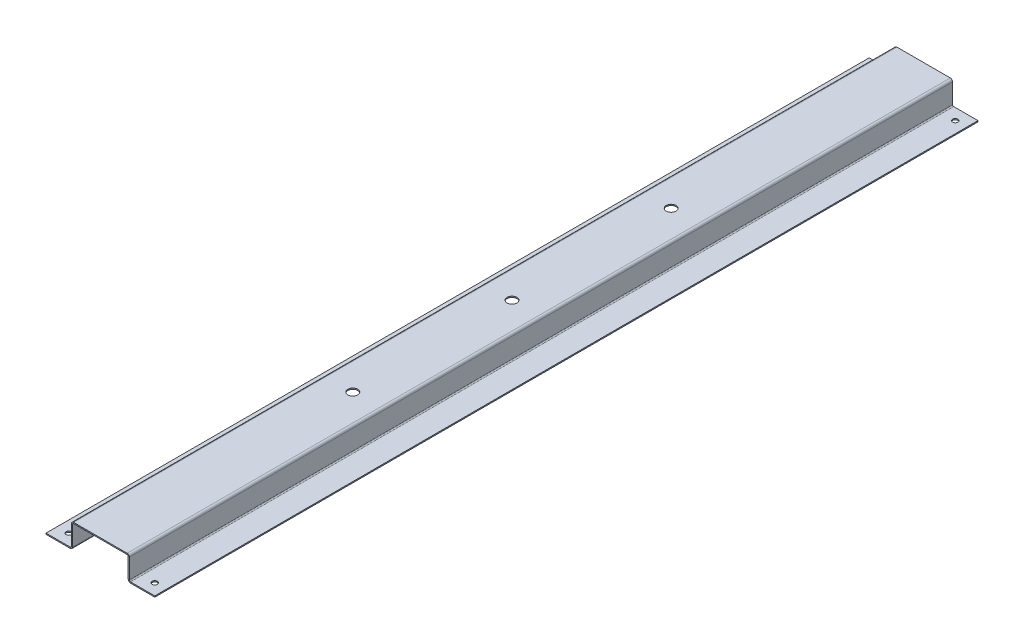
ISO-10303-21;
HEADER;
FILE_DESCRIPTION(('STEP AP214'),'2;1');
FILE_NAME('part.step','',(''),(''),'','','');
FILE_SCHEMA(('AUTOMOTIVE_DESIGN { 1 0 10303 214 1 1 1 1 }'));
ENDSEC;
DATA;
#1=APPLICATION_CONTEXT('core data for automotive mechanical design processes');
#2=APPLICATION_PROTOCOL_DEFINITION('international standard','automotive_design',2000,#1);
#3=PRODUCT_CONTEXT('',#1,'mechanical');
#4=PRODUCT('Part','Part','',(#3));
#5=PRODUCT_RELATED_PRODUCT_CATEGORY('part','',(#4));
#6=PRODUCT_DEFINITION_FORMATION('','',#4);
#7=PRODUCT_DEFINITION_CONTEXT('part definition',#1,'design');
#8=PRODUCT_DEFINITION('design','',#6,#7);
#9=PRODUCT_DEFINITION_SHAPE('','',#8);
#10=(LENGTH_UNIT() NAMED_UNIT(*) SI_UNIT(.MILLI.,.METRE.));
#11=(NAMED_UNIT(*) PLANE_ANGLE_UNIT() SI_UNIT($,.RADIAN.));
#12=(NAMED_UNIT(*) SI_UNIT($,.STERADIAN.) SOLID_ANGLE_UNIT());
#13=UNCERTAINTY_MEASURE_WITH_UNIT(LENGTH_MEASURE(1.E-05),#10,'distance_accuracy_value','');
#14=(GEOMETRIC_REPRESENTATION_CONTEXT(3) GLOBAL_UNCERTAINTY_ASSIGNED_CONTEXT((#13)) GLOBAL_UNIT_ASSIGNED_CONTEXT((#10,
#11,#12)) REPRESENTATION_CONTEXT('',''));
#15=CARTESIAN_POINT('',(0.,0.,0.));
#16=DIRECTION('',(0.,0.,1.));
#17=DIRECTION('',(1.,0.,0.));
#18=AXIS2_PLACEMENT_3D('',#15,#16,#17);
#19=CARTESIAN_POINT('',(36.75,-27.5,543.));
#20=DIRECTION('',(0.,0.,1.));
#21=DIRECTION('',(1.,0.,0.));
#22=AXIS2_PLACEMENT_3D('',#19,#20,#21);
#23=PLANE('',#22);
#24=DIRECTION('',(1.,0.,0.));
#25=VECTOR('',#24,1.);
#26=CARTESIAN_POINT('',(36.75,-27.5,543.));
#27=LINE('',#26,#25);
#28=CARTESIAN_POINT('',(36.75,-27.5,543.));
#29=VERTEX_POINT('',#28);
#30=CARTESIAN_POINT('',(38.25,-27.5,543.));
#31=VERTEX_POINT('',#30);
#32=EDGE_CURVE('E11',#29,#31,#27,.T.);
#33=ORIENTED_EDGE('',*,*,#32,.F.);
#34=CARTESIAN_POINT('',(39.75,-27.5,543.));
#35=DIRECTION('',(0.,0.,1.));
#36=DIRECTION('',(1.,0.,0.));
#37=AXIS2_PLACEMENT_3D('',#34,#35,#36);
#38=CIRCLE('',#37,3.);
#39=CARTESIAN_POINT('',(39.75,-30.5,543.));
#40=VERTEX_POINT('',#39);
#41=EDGE_CURVE('E374',#40,#29,#38,.F.);
#42=ORIENTED_EDGE('',*,*,#41,.F.);
#43=DIRECTION('',(0.,-1.,0.));
#44=VECTOR('',#43,1.);
#45=CARTESIAN_POINT('',(39.75,-29.,543.));
#46=LINE('',#45,#44);
#47=CARTESIAN_POINT('',(39.75,-29.,543.));
#48=VERTEX_POINT('',#47);
#49=EDGE_CURVE('E52',#48,#40,#46,.T.);
#50=ORIENTED_EDGE('',*,*,#49,.F.);
#51=CARTESIAN_POINT('',(39.75,-27.5,543.));
#52=DIRECTION('',(0.,0.,1.));
#53=DIRECTION('',(1.,0.,0.));
#54=AXIS2_PLACEMENT_3D('',#51,#52,#53);
#55=CIRCLE('',#54,1.5);
#56=EDGE_CURVE('E387',#48,#31,#55,.F.);
#57=ORIENTED_EDGE('',*,*,#56,.T.);
#58=EDGE_LOOP('',(#33,#42,#50,#57));
#59=FACE_BOUND('',#58,.T.);
#60=ADVANCED_FACE('F44',(#59),#23,.T.);
#61=CARTESIAN_POINT('',(39.75,-29.,543.));
#62=DIRECTION('',(0.,0.,1.));
#63=DIRECTION('',(1.,0.,0.));
#64=AXIS2_PLACEMENT_3D('',#61,#62,#63);
#65=PLANE('',#64);
#66=DIRECTION('',(0.,1.,0.));
#67=VECTOR('',#66,1.);
#68=CARTESIAN_POINT('',(36.75,0.,543.));
#69=LINE('',#68,#67);
#70=CARTESIAN_POINT('',(36.75,-1.5,543.));
#71=VERTEX_POINT('',#70);
#72=EDGE_CURVE('E378',#29,#71,#69,.T.);
#73=ORIENTED_EDGE('',*,*,#72,.F.);
#74=ORIENTED_EDGE('',*,*,#32,.T.);
#75=DIRECTION('',(0.,1.,0.));
#76=VECTOR('',#75,1.);
#77=CARTESIAN_POINT('',(38.25,0.,543.));
#78=LINE('',#77,#76);
#79=CARTESIAN_POINT('',(38.25,-1.5,543.));
#80=VERTEX_POINT('',#79);
#81=EDGE_CURVE('E389',#31,#80,#78,.T.);
#82=ORIENTED_EDGE('',*,*,#81,.T.);
#83=DIRECTION('',(-1.,0.,0.));
#84=VECTOR('',#83,1.);
#85=CARTESIAN_POINT('',(38.25,-1.5,543.));
#86=LINE('',#85,#84);
#87=EDGE_CURVE('E348',#80,#71,#86,.T.);
#88=ORIENTED_EDGE('',*,*,#87,.T.);
#89=EDGE_LOOP('',(#73,#74,#82,#88));
#90=FACE_BOUND('',#89,.T.);
#91=ADVANCED_FACE('F459',(#90),#65,.T.);
#92=CARTESIAN_POINT('',(39.75,-30.5,-543.));
#93=DIRECTION('',(0.,0.,-1.));
#94=DIRECTION('',(-1.,0.,0.));
#95=AXIS2_PLACEMENT_3D('',#92,#93,#94);
#96=PLANE('',#95);
#97=DIRECTION('',(0.,1.,0.));
#98=VECTOR('',#97,1.);
#99=CARTESIAN_POINT('',(39.75,-30.5,-543.));
#100=LINE('',#99,#98);
#101=CARTESIAN_POINT('',(39.75,-30.5,-543.));
#102=VERTEX_POINT('',#101);
#103=CARTESIAN_POINT('',(39.75,-29.,-543.));
#104=VERTEX_POINT('',#103);
#105=EDGE_CURVE('E354',#102,#104,#100,.T.);
#106=ORIENTED_EDGE('',*,*,#105,.F.);
#107=CARTESIAN_POINT('',(39.75,-27.5,-543.));
#108=DIRECTION('',(0.,0.,1.));
#109=DIRECTION('',(1.,0.,0.));
#110=AXIS2_PLACEMENT_3D('',#107,#108,#109);
#111=CIRCLE('',#110,3.);
#112=CARTESIAN_POINT('',(36.75,-27.5,-543.));
#113=VERTEX_POINT('',#112);
#114=EDGE_CURVE('E258',#102,#113,#111,.F.);
#115=ORIENTED_EDGE('',*,*,#114,.T.);
#116=DIRECTION('',(-1.,0.,0.));
#117=VECTOR('',#116,1.);
#118=CARTESIAN_POINT('',(38.25,-27.5,-543.));
#119=LINE('',#118,#117);
#120=CARTESIAN_POINT('',(38.25,-27.5,-543.));
#121=VERTEX_POINT('',#120);
#122=EDGE_CURVE('E352',#121,#113,#119,.T.);
#123=ORIENTED_EDGE('',*,*,#122,.F.);
#124=CARTESIAN_POINT('',(39.75,-27.5,-543.));
#125=DIRECTION('',(0.,0.,1.));
#126=DIRECTION('',(1.,0.,0.));
#127=AXIS2_PLACEMENT_3D('',#124,#125,#126);
#128=CIRCLE('',#127,1.5);
#129=EDGE_CURVE('E270',#104,#121,#128,.F.);
#130=ORIENTED_EDGE('',*,*,#129,.F.);
#131=EDGE_LOOP('',(#106,#115,#123,#130));
#132=FACE_BOUND('',#131,.T.);
#133=ADVANCED_FACE('F501',(#132),#96,.T.);
#134=CARTESIAN_POINT('',(38.25,-27.5,-543.));
#135=DIRECTION('',(0.,0.,-1.));
#136=DIRECTION('',(-1.,0.,0.));
#137=AXIS2_PLACEMENT_3D('',#134,#135,#136);
#138=PLANE('',#137);
#139=DIRECTION('',(-1.,0.,0.));
#140=VECTOR('',#139,1.);
#141=CARTESIAN_POINT('',(36.75,-30.5,-543.));
#142=LINE('',#141,#140);
#143=CARTESIAN_POINT('',(71.75,-30.5,-543.));
#144=VERTEX_POINT('',#143);
#145=EDGE_CURVE('E261',#144,#102,#142,.T.);
#146=ORIENTED_EDGE('',*,*,#145,.T.);
#147=ORIENTED_EDGE('',*,*,#105,.T.);
#148=DIRECTION('',(-1.,0.,0.));
#149=VECTOR('',#148,1.);
#150=CARTESIAN_POINT('',(36.75,-29.,-543.));
#151=LINE('',#150,#149);
#152=CARTESIAN_POINT('',(71.75,-29.,-543.));
#153=VERTEX_POINT('',#152);
#154=EDGE_CURVE('E267',#153,#104,#151,.T.);
#155=ORIENTED_EDGE('',*,*,#154,.F.);
#156=DIRECTION('',(0.,-1.,0.));
#157=VECTOR('',#156,1.);
#158=CARTESIAN_POINT('',(71.75,-29.,-543.));
#159=LINE('',#158,#157);
#160=EDGE_CURVE('E264',#153,#144,#159,.T.);
#161=ORIENTED_EDGE('',*,*,#160,.T.);
#162=EDGE_LOOP('',(#146,#147,#155,#161));
#163=FACE_BOUND('',#162,.T.);
#164=ADVANCED_FACE('F505',(#163),#138,.T.);
#165=CARTESIAN_POINT('',(35.25,0.,543.));
#166=DIRECTION('',(0.,0.,1.));
#167=DIRECTION('',(1.,0.,0.));
#168=AXIS2_PLACEMENT_3D('',#165,#166,#167);
#169=PLANE('',#168);
#170=DIRECTION('',(0.,1.,0.));
#171=VECTOR('',#170,1.);
#172=CARTESIAN_POINT('',(35.25,0.,543.));
#173=LINE('',#172,#171);
#174=CARTESIAN_POINT('',(35.25,0.,543.));
#175=VERTEX_POINT('',#174);
#176=CARTESIAN_POINT('',(35.25,1.5,543.));
#177=VERTEX_POINT('',#176);
#178=EDGE_CURVE('E350',#175,#177,#173,.T.);
#179=ORIENTED_EDGE('',*,*,#178,.F.);
#180=CARTESIAN_POINT('',(35.25,-1.5,543.));
#181=DIRECTION('',(0.,0.,-1.));
#182=DIRECTION('',(-1.,0.,0.));
#183=AXIS2_PLACEMENT_3D('',#180,#181,#182);
#184=CIRCLE('',#183,1.5);
#185=EDGE_CURVE('E449',#71,#175,#184,.F.);
#186=ORIENTED_EDGE('',*,*,#185,.F.);
#187=ORIENTED_EDGE('',*,*,#87,.F.);
#188=CARTESIAN_POINT('',(35.25,-1.5,543.));
#189=DIRECTION('',(0.,0.,1.));
#190=DIRECTION('',(1.,0.,0.));
#191=AXIS2_PLACEMENT_3D('',#188,#189,#190);
#192=CIRCLE('',#191,3.);
#193=EDGE_CURVE('E392',#80,#177,#192,.T.);
#194=ORIENTED_EDGE('',*,*,#193,.T.);
#195=EDGE_LOOP('',(#179,#186,#187,#194));
#196=FACE_BOUND('',#195,.T.);
#197=ADVANCED_FACE('F466',(#196),#169,.T.);
#198=CARTESIAN_POINT('',(38.25,-1.5,543.));
#199=DIRECTION('',(0.,0.,1.));
#200=DIRECTION('',(1.,0.,0.));
#201=AXIS2_PLACEMENT_3D('',#198,#199,#200);
#202=PLANE('',#201);
#203=DIRECTION('',(-1.,0.,0.));
#204=VECTOR('',#203,1.);
#205=CARTESIAN_POINT('',(-36.75,0.,543.));
#206=LINE('',#205,#204);
#207=CARTESIAN_POINT('',(-35.25,0.,543.));
#208=VERTEX_POINT('',#207);
#209=EDGE_CURVE('E446',#175,#208,#206,.T.);
#210=ORIENTED_EDGE('',*,*,#209,.F.);
#211=ORIENTED_EDGE('',*,*,#178,.T.);
#212=DIRECTION('',(1.,0.,0.));
#213=VECTOR('',#212,1.);
#214=CARTESIAN_POINT('',(-36.75,1.5,543.));
#215=LINE('',#214,#213);
#216=CARTESIAN_POINT('',(-35.25,1.5,543.));
#217=VERTEX_POINT('',#216);
#218=EDGE_CURVE('E211',#177,#217,#215,.F.);
#219=ORIENTED_EDGE('',*,*,#218,.T.);
#220=DIRECTION('',(0.,-1.,0.));
#221=VECTOR('',#220,1.);
#222=CARTESIAN_POINT('',(-35.25,1.5,543.));
#223=LINE('',#222,#221);
#224=EDGE_CURVE('E202',#217,#208,#223,.T.);
#225=ORIENTED_EDGE('',*,*,#224,.T.);
#226=EDGE_LOOP('',(#210,#211,#219,#225));
#227=FACE_BOUND('',#226,.T.);
#228=ADVANCED_FACE('F398',(#227),#202,.T.);
#229=CARTESIAN_POINT('',(36.75,-1.5,-543.));
#230=DIRECTION('',(0.,0.,-1.));
#231=DIRECTION('',(-1.,0.,0.));
#232=AXIS2_PLACEMENT_3D('',#229,#230,#231);
#233=PLANE('',#232);
#234=DIRECTION('',(1.,0.,0.));
#235=VECTOR('',#234,1.);
#236=CARTESIAN_POINT('',(36.75,-1.5,-543.));
#237=LINE('',#236,#235);
#238=CARTESIAN_POINT('',(36.75,-1.5,-543.));
#239=VERTEX_POINT('',#238);
#240=CARTESIAN_POINT('',(38.25,-1.5,-543.));
#241=VERTEX_POINT('',#240);
#242=EDGE_CURVE('E346',#239,#241,#237,.T.);
#243=ORIENTED_EDGE('',*,*,#242,.F.);
#244=CARTESIAN_POINT('',(35.25,-1.5,-543.));
#245=DIRECTION('',(0.,0.,-1.));
#246=DIRECTION('',(-1.,0.,0.));
#247=AXIS2_PLACEMENT_3D('',#244,#245,#246);
#248=CIRCLE('',#247,1.5);
#249=CARTESIAN_POINT('',(35.25,0.,-543.));
#250=VERTEX_POINT('',#249);
#251=EDGE_CURVE('E252',#239,#250,#248,.F.);
#252=ORIENTED_EDGE('',*,*,#251,.T.);
#253=DIRECTION('',(0.,-1.,0.));
#254=VECTOR('',#253,1.);
#255=CARTESIAN_POINT('',(35.25,1.5,-543.));
#256=LINE('',#255,#254);
#257=CARTESIAN_POINT('',(35.25,1.5,-543.));
#258=VERTEX_POINT('',#257);
#259=EDGE_CURVE('E201',#258,#250,#256,.T.);
#260=ORIENTED_EDGE('',*,*,#259,.F.);
#261=CARTESIAN_POINT('',(35.25,-1.5,-543.));
#262=DIRECTION('',(0.,0.,1.));
#263=DIRECTION('',(1.,0.,0.));
#264=AXIS2_PLACEMENT_3D('',#261,#262,#263);
#265=CIRCLE('',#264,3.);
#266=EDGE_CURVE('E276',#241,#258,#265,.T.);
#267=ORIENTED_EDGE('',*,*,#266,.F.);
#268=EDGE_LOOP('',(#243,#252,#260,#267));
#269=FACE_BOUND('',#268,.T.);
#270=ADVANCED_FACE('F475',(#269),#233,.T.);
#271=CARTESIAN_POINT('',(35.25,1.5,-543.));
#272=DIRECTION('',(0.,0.,-1.));
#273=DIRECTION('',(-1.,0.,0.));
#274=AXIS2_PLACEMENT_3D('',#271,#272,#273);
#275=PLANE('',#274);
#276=DIRECTION('',(0.,1.,0.));
#277=VECTOR('',#276,1.);
#278=CARTESIAN_POINT('',(36.75,0.,-543.));
#279=LINE('',#278,#277);
#280=EDGE_CURVE('E255',#113,#239,#279,.T.);
#281=ORIENTED_EDGE('',*,*,#280,.T.);
#282=ORIENTED_EDGE('',*,*,#242,.T.);
#283=DIRECTION('',(0.,1.,0.));
#284=VECTOR('',#283,1.);
#285=CARTESIAN_POINT('',(38.25,0.,-543.));
#286=LINE('',#285,#284);
#287=EDGE_CURVE('E273',#121,#241,#286,.T.);
#288=ORIENTED_EDGE('',*,*,#287,.F.);
#289=ORIENTED_EDGE('',*,*,#122,.T.);
#290=EDGE_LOOP('',(#281,#282,#288,#289));
#291=FACE_BOUND('',#290,.T.);
#292=ADVANCED_FACE('F479',(#291),#275,.T.);
#293=CARTESIAN_POINT('',(-36.75,-1.5,543.));
#294=DIRECTION('',(0.,0.,1.));
#295=DIRECTION('',(1.,0.,0.));
#296=AXIS2_PLACEMENT_3D('',#293,#294,#295);
#297=PLANE('',#296);
#298=DIRECTION('',(-1.,0.,0.));
#299=VECTOR('',#298,1.);
#300=CARTESIAN_POINT('',(-36.75,-1.5,543.));
#301=LINE('',#300,#299);
#302=CARTESIAN_POINT('',(-36.75,-1.5,543.));
#303=VERTEX_POINT('',#302);
#304=CARTESIAN_POINT('',(-38.25,-1.5,543.));
#305=VERTEX_POINT('',#304);
#306=EDGE_CURVE('E189',#303,#305,#301,.T.);
#307=ORIENTED_EDGE('',*,*,#306,.F.);
#308=CARTESIAN_POINT('',(-35.25,-1.5,543.));
#309=DIRECTION('',(0.,0.,-1.));
#310=DIRECTION('',(-1.,0.,0.));
#311=AXIS2_PLACEMENT_3D('',#308,#309,#310);
#312=CIRCLE('',#311,1.5);
#313=EDGE_CURVE('E410',#208,#303,#312,.F.);
#314=ORIENTED_EDGE('',*,*,#313,.F.);
#315=ORIENTED_EDGE('',*,*,#224,.F.);
#316=CARTESIAN_POINT('',(-35.25,-1.5,543.));
#317=DIRECTION('',(0.,0.,1.));
#318=DIRECTION('',(1.,0.,0.));
#319=AXIS2_PLACEMENT_3D('',#316,#317,#318);
#320=CIRCLE('',#319,3.);
#321=EDGE_CURVE('E205',#217,#305,#320,.T.);
#322=ORIENTED_EDGE('',*,*,#321,.T.);
#323=EDGE_LOOP('',(#307,#314,#315,#322));
#324=FACE_BOUND('',#323,.T.);
#325=ADVANCED_FACE('F207',(#324),#297,.T.);
#326=CARTESIAN_POINT('',(-35.25,1.5,543.));
#327=DIRECTION('',(0.,0.,1.));
#328=DIRECTION('',(1.,0.,0.));
#329=AXIS2_PLACEMENT_3D('',#326,#327,#328);
#330=PLANE('',#329);
#331=DIRECTION('',(0.,-1.,0.));
#332=VECTOR('',#331,1.);
#333=CARTESIAN_POINT('',(-36.75,0.,543.));
#334=LINE('',#333,#332);
#335=CARTESIAN_POINT('',(-36.75,-27.5,543.));
#336=VERTEX_POINT('',#335);
#337=EDGE_CURVE('E196',#303,#336,#334,.T.);
#338=ORIENTED_EDGE('',*,*,#337,.F.);
#339=ORIENTED_EDGE('',*,*,#306,.T.);
#340=DIRECTION('',(0.,-1.,0.));
#341=VECTOR('',#340,1.);
#342=CARTESIAN_POINT('',(-38.25,0.,543.));
#343=LINE('',#342,#341);
#344=CARTESIAN_POINT('',(-38.25,-27.5,543.));
#345=VERTEX_POINT('',#344);
#346=EDGE_CURVE('E193',#305,#345,#343,.T.);
#347=ORIENTED_EDGE('',*,*,#346,.T.);
#348=DIRECTION('',(1.,0.,0.));
#349=VECTOR('',#348,1.);
#350=CARTESIAN_POINT('',(-38.25,-27.5,543.));
#351=LINE('',#350,#349);
#352=EDGE_CURVE('E337',#345,#336,#351,.T.);
#353=ORIENTED_EDGE('',*,*,#352,.T.);
#354=EDGE_LOOP('',(#338,#339,#347,#353));
#355=FACE_BOUND('',#354,.T.);
#356=ADVANCED_FACE('F191',(#355),#330,.T.);
#357=CARTESIAN_POINT('',(-35.25,0.,-543.));
#358=DIRECTION('',(0.,0.,-1.));
#359=DIRECTION('',(-1.,0.,0.));
#360=AXIS2_PLACEMENT_3D('',#357,#358,#359);
#361=PLANE('',#360);
#362=DIRECTION('',(0.,1.,0.));
#363=VECTOR('',#362,1.);
#364=CARTESIAN_POINT('',(-35.25,0.,-543.));
#365=LINE('',#364,#363);
#366=CARTESIAN_POINT('',(-35.25,0.,-543.));
#367=VERTEX_POINT('',#366);
#368=CARTESIAN_POINT('',(-35.25,1.5,-543.));
#369=VERTEX_POINT('',#368);
#370=EDGE_CURVE('E342',#367,#369,#365,.T.);
#371=ORIENTED_EDGE('',*,*,#370,.F.);
#372=CARTESIAN_POINT('',(-35.25,-1.5,-543.));
#373=DIRECTION('',(0.,0.,-1.));
#374=DIRECTION('',(-1.,0.,0.));
#375=AXIS2_PLACEMENT_3D('',#372,#373,#374);
#376=CIRCLE('',#375,1.5);
#377=CARTESIAN_POINT('',(-36.75,-1.5,-543.));
#378=VERTEX_POINT('',#377);
#379=EDGE_CURVE('E246',#367,#378,#376,.F.);
#380=ORIENTED_EDGE('',*,*,#379,.T.);
#381=DIRECTION('',(1.,0.,0.));
#382=VECTOR('',#381,1.);
#383=CARTESIAN_POINT('',(-38.25,-1.5,-543.));
#384=LINE('',#383,#382);
#385=CARTESIAN_POINT('',(-38.25,-1.5,-543.));
#386=VERTEX_POINT('',#385);
#387=EDGE_CURVE('E340',#386,#378,#384,.T.);
#388=ORIENTED_EDGE('',*,*,#387,.F.);
#389=CARTESIAN_POINT('',(-35.25,-1.5,-543.));
#390=DIRECTION('',(0.,0.,1.));
#391=DIRECTION('',(1.,0.,0.));
#392=AXIS2_PLACEMENT_3D('',#389,#390,#391);
#393=CIRCLE('',#392,3.);
#394=EDGE_CURVE('E218',#369,#386,#393,.T.);
#395=ORIENTED_EDGE('',*,*,#394,.F.);
#396=EDGE_LOOP('',(#371,#380,#388,#395));
#397=FACE_BOUND('',#396,.T.);
#398=ADVANCED_FACE('F404',(#397),#361,.T.);
#399=CARTESIAN_POINT('',(-38.25,-1.5,-543.));
#400=DIRECTION('',(0.,0.,-1.));
#401=DIRECTION('',(-1.,0.,0.));
#402=AXIS2_PLACEMENT_3D('',#399,#400,#401);
#403=PLANE('',#402);
#404=DIRECTION('',(-1.,0.,0.));
#405=VECTOR('',#404,1.);
#406=CARTESIAN_POINT('',(-36.75,0.,-543.));
#407=LINE('',#406,#405);
#408=EDGE_CURVE('E249',#250,#367,#407,.T.);
#409=ORIENTED_EDGE('',*,*,#408,.T.);
#410=ORIENTED_EDGE('',*,*,#370,.T.);
#411=DIRECTION('',(1.,0.,0.));
#412=VECTOR('',#411,1.);
#413=CARTESIAN_POINT('',(-36.75,1.5,-543.));
#414=LINE('',#413,#412);
#415=EDGE_CURVE('E279',#258,#369,#414,.F.);
#416=ORIENTED_EDGE('',*,*,#415,.F.);
#417=ORIENTED_EDGE('',*,*,#259,.T.);
#418=EDGE_LOOP('',(#409,#410,#416,#417));
#419=FACE_BOUND('',#418,.T.);
#420=ADVANCED_FACE('F485',(#419),#403,.T.);
#421=CARTESIAN_POINT('',(-39.75,-30.5,543.));
#422=DIRECTION('',(0.,0.,1.));
#423=DIRECTION('',(1.,0.,0.));
#424=AXIS2_PLACEMENT_3D('',#421,#422,#423);
#425=PLANE('',#424);
#426=DIRECTION('',(0.,1.,0.));
#427=VECTOR('',#426,1.);
#428=CARTESIAN_POINT('',(-39.75,-30.5,543.));
#429=LINE('',#428,#427);
#430=CARTESIAN_POINT('',(-39.75,-30.5,543.));
#431=VERTEX_POINT('',#430);
#432=CARTESIAN_POINT('',(-39.75,-29.,543.));
#433=VERTEX_POINT('',#432);
#434=EDGE_CURVE('E60',#431,#433,#429,.T.);
#435=ORIENTED_EDGE('',*,*,#434,.F.);
#436=CARTESIAN_POINT('',(-39.75,-27.5,543.));
#437=DIRECTION('',(0.,0.,1.));
#438=DIRECTION('',(1.,0.,0.));
#439=AXIS2_PLACEMENT_3D('',#436,#437,#438);
#440=CIRCLE('',#439,3.);
#441=EDGE_CURVE('E438',#336,#431,#440,.F.);
#442=ORIENTED_EDGE('',*,*,#441,.F.);
#443=ORIENTED_EDGE('',*,*,#352,.F.);
#444=CARTESIAN_POINT('',(-39.75,-27.5,543.));
#445=DIRECTION('',(0.,0.,1.));
#446=DIRECTION('',(1.,0.,0.));
#447=AXIS2_PLACEMENT_3D('',#444,#445,#446);
#448=CIRCLE('',#447,1.5);
#449=EDGE_CURVE('E226',#345,#433,#448,.F.);
#450=ORIENTED_EDGE('',*,*,#449,.T.);
#451=EDGE_LOOP('',(#435,#442,#443,#450));
#452=FACE_BOUND('',#451,.T.);
#453=ADVANCED_FACE('F487',(#452),#425,.T.);
#454=CARTESIAN_POINT('',(-38.25,-27.5,543.));
#455=DIRECTION('',(0.,0.,1.));
#456=DIRECTION('',(1.,0.,0.));
#457=AXIS2_PLACEMENT_3D('',#454,#455,#456);
#458=PLANE('',#457);
#459=DIRECTION('',(-1.,0.,0.));
#460=VECTOR('',#459,1.);
#461=CARTESIAN_POINT('',(-36.75,-30.5,543.));
#462=LINE('',#461,#460);
#463=CARTESIAN_POINT('',(-71.75,-30.5,543.));
#464=VERTEX_POINT('',#463);
#465=EDGE_CURVE('E436',#431,#464,#462,.T.);
#466=ORIENTED_EDGE('',*,*,#465,.F.);
#467=ORIENTED_EDGE('',*,*,#434,.T.);
#468=DIRECTION('',(1.,0.,0.));
#469=VECTOR('',#468,1.);
#470=CARTESIAN_POINT('',(-36.75,-29.,543.));
#471=LINE('',#470,#469);
#472=CARTESIAN_POINT('',(-71.75,-29.,543.));
#473=VERTEX_POINT('',#472);
#474=EDGE_CURVE('E138',#433,#473,#471,.F.);
#475=ORIENTED_EDGE('',*,*,#474,.T.);
#476=DIRECTION('',(0.,1.,0.));
#477=VECTOR('',#476,1.);
#478=CARTESIAN_POINT('',(-71.75,-30.5,543.));
#479=LINE('',#478,#477);
#480=EDGE_CURVE('E434',#464,#473,#479,.T.);
#481=ORIENTED_EDGE('',*,*,#480,.F.);
#482=EDGE_LOOP('',(#466,#467,#475,#481));
#483=FACE_BOUND('',#482,.T.);
#484=ADVANCED_FACE('F493',(#483),#458,.T.);
#485=CARTESIAN_POINT('',(-36.75,-27.5,-543.));
#486=DIRECTION('',(0.,0.,-1.));
#487=DIRECTION('',(-1.,0.,0.));
#488=AXIS2_PLACEMENT_3D('',#485,#486,#487);
#489=PLANE('',#488);
#490=DIRECTION('',(-1.,0.,0.));
#491=VECTOR('',#490,1.);
#492=CARTESIAN_POINT('',(-36.75,-27.5,-543.));
#493=LINE('',#492,#491);
#494=CARTESIAN_POINT('',(-36.75,-27.5,-543.));
#495=VERTEX_POINT('',#494);
#496=CARTESIAN_POINT('',(-38.25,-27.5,-543.));
#497=VERTEX_POINT('',#496);
#498=EDGE_CURVE('E125',#495,#497,#493,.T.);
#499=ORIENTED_EDGE('',*,*,#498,.F.);
#500=CARTESIAN_POINT('',(-39.75,-27.5,-543.));
#501=DIRECTION('',(0.,0.,1.));
#502=DIRECTION('',(1.,0.,0.));
#503=AXIS2_PLACEMENT_3D('',#500,#501,#502);
#504=CIRCLE('',#503,3.);
#505=CARTESIAN_POINT('',(-39.75,-30.5,-543.));
#506=VERTEX_POINT('',#505);
#507=EDGE_CURVE('E242',#495,#506,#504,.F.);
#508=ORIENTED_EDGE('',*,*,#507,.T.);
#509=DIRECTION('',(0.,-1.,0.));
#510=VECTOR('',#509,1.);
#511=CARTESIAN_POINT('',(-39.75,-29.,-543.));
#512=LINE('',#511,#510);
#513=CARTESIAN_POINT('',(-39.75,-29.,-543.));
#514=VERTEX_POINT('',#513);
#515=EDGE_CURVE('E132',#514,#506,#512,.T.);
#516=ORIENTED_EDGE('',*,*,#515,.F.);
#517=CARTESIAN_POINT('',(-39.75,-27.5,-543.));
#518=DIRECTION('',(0.,0.,1.));
#519=DIRECTION('',(1.,0.,0.));
#520=AXIS2_PLACEMENT_3D('',#517,#518,#519);
#521=CIRCLE('',#520,1.5);
#522=EDGE_CURVE('E285',#497,#514,#521,.F.);
#523=ORIENTED_EDGE('',*,*,#522,.F.);
#524=EDGE_LOOP('',(#499,#508,#516,#523));
#525=FACE_BOUND('',#524,.T.);
#526=ADVANCED_FACE('F421',(#525),#489,.T.);
#527=CARTESIAN_POINT('',(-39.75,-29.,-543.));
#528=DIRECTION('',(0.,0.,-1.));
#529=DIRECTION('',(-1.,0.,0.));
#530=AXIS2_PLACEMENT_3D('',#527,#528,#529);
#531=PLANE('',#530);
#532=DIRECTION('',(0.,-1.,0.));
#533=VECTOR('',#532,1.);
#534=CARTESIAN_POINT('',(-36.75,0.,-543.));
#535=LINE('',#534,#533);
#536=EDGE_CURVE('E244',#378,#495,#535,.T.);
#537=ORIENTED_EDGE('',*,*,#536,.T.);
#538=ORIENTED_EDGE('',*,*,#498,.T.);
#539=DIRECTION('',(0.,-1.,0.));
#540=VECTOR('',#539,1.);
#541=CARTESIAN_POINT('',(-38.25,0.,-543.));
#542=LINE('',#541,#540);
#543=EDGE_CURVE('E283',#386,#497,#542,.T.);
#544=ORIENTED_EDGE('',*,*,#543,.F.);
#545=ORIENTED_EDGE('',*,*,#387,.T.);
#546=EDGE_LOOP('',(#537,#538,#544,#545));
#547=FACE_BOUND('',#546,.T.);
#548=ADVANCED_FACE('F406',(#547),#531,.T.);
#549=CARTESIAN_POINT('',(-36.75,-29.,543.));
#550=DIRECTION('',(0.,-1.,0.));
#551=DIRECTION('',(0.,0.,-1.));
#552=AXIS2_PLACEMENT_3D('',#549,#550,#551);
#553=PLANE('',#552);
#554=CARTESIAN_POINT('',(-56.75,-29.,-528.));
#555=DIRECTION('',(0.,-1.,0.));
#556=DIRECTION('',(1.,0.,0.));
#557=AXIS2_PLACEMENT_3D('',#554,#555,#556);
#558=CIRCLE('',#557,3.50000000000001);
#559=CARTESIAN_POINT('',(-53.25,-29.,-528.));
#560=VERTEX_POINT('',#559);
#561=EDGE_CURVE('E997',#560,#560,#558,.T.);
#562=ORIENTED_EDGE('',*,*,#561,.T.);
#563=EDGE_LOOP('',(#562));
#564=FACE_BOUND('',#563,.T.);
#565=CARTESIAN_POINT('',(-56.75,-29.,528.));
#566=DIRECTION('',(0.,-1.,0.));
#567=DIRECTION('',(1.,0.,0.));
#568=AXIS2_PLACEMENT_3D('',#565,#566,#567);
#569=CIRCLE('',#568,3.50000000000001);
#570=CARTESIAN_POINT('',(-53.25,-29.,528.));
#571=VERTEX_POINT('',#570);
#572=EDGE_CURVE('E990',#571,#571,#569,.T.);
#573=ORIENTED_EDGE('',*,*,#572,.T.);
#574=EDGE_LOOP('',(#573));
#575=FACE_BOUND('',#574,.T.);
#576=DIRECTION('',(1.,0.,0.));
#577=VECTOR('',#576,1.);
#578=CARTESIAN_POINT('',(-36.75,-29.,-543.));
#579=LINE('',#578,#577);
#580=CARTESIAN_POINT('',(-71.75,-29.,-543.));
#581=VERTEX_POINT('',#580);
#582=EDGE_CURVE('E232',#514,#581,#579,.F.);
#583=ORIENTED_EDGE('',*,*,#582,.T.);
#584=DIRECTION('',(0.,0.,-1.));
#585=VECTOR('',#584,1.);
#586=CARTESIAN_POINT('',(-71.75,-29.,543.));
#587=LINE('',#586,#585);
#588=EDGE_CURVE('E333',#473,#581,#587,.T.);
#589=ORIENTED_EDGE('',*,*,#588,.F.);
#590=ORIENTED_EDGE('',*,*,#474,.F.);
#591=DIRECTION('',(0.,0.,-1.));
#592=VECTOR('',#591,1.);
#593=CARTESIAN_POINT('',(-39.75,-29.,543.));
#594=LINE('',#593,#592);
#595=EDGE_CURVE('E228',#433,#514,#594,.T.);
#596=ORIENTED_EDGE('',*,*,#595,.T.);
#597=EDGE_LOOP('',(#583,#589,#590,#596));
#598=FACE_BOUND('',#597,.T.);
#599=ADVANCED_FACE('F427',(#564,#575,#598),#553,.F.);
#600=CARTESIAN_POINT('',(-71.75,-30.5,543.));
#601=DIRECTION('',(-1.,0.,0.));
#602=DIRECTION('',(0.,0.,1.));
#603=AXIS2_PLACEMENT_3D('',#600,#601,#602);
#604=PLANE('',#603);
#605=DIRECTION('',(0.,1.,0.));
#606=VECTOR('',#605,1.);
#607=CARTESIAN_POINT('',(-71.75,-30.5,-543.));
#608=LINE('',#607,#606);
#609=CARTESIAN_POINT('',(-71.75,-30.5,-543.));
#610=VERTEX_POINT('',#609);
#611=EDGE_CURVE('E235',#610,#581,#608,.T.);
#612=ORIENTED_EDGE('',*,*,#611,.F.);
#613=DIRECTION('',(0.,0.,-1.));
#614=VECTOR('',#613,1.);
#615=CARTESIAN_POINT('',(-71.75,-30.5,543.));
#616=LINE('',#615,#614);
#617=EDGE_CURVE('E331',#464,#610,#616,.T.);
#618=ORIENTED_EDGE('',*,*,#617,.F.);
#619=ORIENTED_EDGE('',*,*,#480,.T.);
#620=ORIENTED_EDGE('',*,*,#588,.T.);
#621=EDGE_LOOP('',(#612,#618,#619,#620));
#622=FACE_BOUND('',#621,.T.);
#623=ADVANCED_FACE('F432',(#622),#604,.T.);
#624=CARTESIAN_POINT('',(-36.75,-30.5,543.));
#625=DIRECTION('',(0.,-1.,0.));
#626=DIRECTION('',(0.,0.,-1.));
#627=AXIS2_PLACEMENT_3D('',#624,#625,#626);
#628=PLANE('',#627);
#629=CARTESIAN_POINT('',(-56.75,-30.5,-528.));
#630=DIRECTION('',(0.,-1.,0.));
#631=DIRECTION('',(1.,0.,0.));
#632=AXIS2_PLACEMENT_3D('',#629,#630,#631);
#633=CIRCLE('',#632,3.50000000000001);
#634=CARTESIAN_POINT('',(-53.25,-30.5,-528.));
#635=VERTEX_POINT('',#634);
#636=EDGE_CURVE('E1000',#635,#635,#633,.T.);
#637=ORIENTED_EDGE('',*,*,#636,.F.);
#638=EDGE_LOOP('',(#637));
#639=FACE_BOUND('',#638,.T.);
#640=CARTESIAN_POINT('',(-56.75,-30.5,528.));
#641=DIRECTION('',(0.,-1.,0.));
#642=DIRECTION('',(1.,0.,0.));
#643=AXIS2_PLACEMENT_3D('',#640,#641,#642);
#644=CIRCLE('',#643,3.50000000000001);
#645=CARTESIAN_POINT('',(-53.25,-30.5,528.));
#646=VERTEX_POINT('',#645);
#647=EDGE_CURVE('E994',#646,#646,#644,.T.);
#648=ORIENTED_EDGE('',*,*,#647,.F.);
#649=EDGE_LOOP('',(#648));
#650=FACE_BOUND('',#649,.T.);
#651=DIRECTION('',(-1.,0.,0.));
#652=VECTOR('',#651,1.);
#653=CARTESIAN_POINT('',(-36.75,-30.5,-543.));
#654=LINE('',#653,#652);
#655=EDGE_CURVE('E239',#506,#610,#654,.T.);
#656=ORIENTED_EDGE('',*,*,#655,.F.);
#657=DIRECTION('',(0.,0.,-1.));
#658=VECTOR('',#657,1.);
#659=CARTESIAN_POINT('',(-39.75,-30.5,543.));
#660=LINE('',#659,#658);
#661=EDGE_CURVE('E328',#431,#506,#660,.T.);
#662=ORIENTED_EDGE('',*,*,#661,.F.);
#663=ORIENTED_EDGE('',*,*,#465,.T.);
#664=ORIENTED_EDGE('',*,*,#617,.T.);
#665=EDGE_LOOP('',(#656,#662,#663,#664));
#666=FACE_BOUND('',#665,.T.);
#667=ADVANCED_FACE('F594',(#639,#650,#666),#628,.T.);
#668=CARTESIAN_POINT('',(-39.75,-27.5,543.));
#669=DIRECTION('',(0.,0.,-1.));
#670=DIRECTION('',(-1.,0.,0.));
#671=AXIS2_PLACEMENT_3D('',#668,#669,#670);
#672=CYLINDRICAL_SURFACE('',#671,3.);
#673=ORIENTED_EDGE('',*,*,#507,.F.);
#674=DIRECTION('',(0.,0.,-1.));
#675=VECTOR('',#674,1.);
#676=CARTESIAN_POINT('',(-36.75,-27.5,543.));
#677=LINE('',#676,#675);
#678=EDGE_CURVE('E325',#336,#495,#677,.T.);
#679=ORIENTED_EDGE('',*,*,#678,.F.);
#680=ORIENTED_EDGE('',*,*,#441,.T.);
#681=ORIENTED_EDGE('',*,*,#661,.T.);
#682=EDGE_LOOP('',(#673,#679,#680,#681));
#683=FACE_BOUND('',#682,.T.);
#684=ADVANCED_FACE('F418',(#683),#672,.T.);
#685=CARTESIAN_POINT('',(-36.75,0.,543.));
#686=DIRECTION('',(1.,0.,0.));
#687=DIRECTION('',(0.,1.,0.));
#688=AXIS2_PLACEMENT_3D('',#685,#686,#687);
#689=PLANE('',#688);
#690=ORIENTED_EDGE('',*,*,#536,.F.);
#691=DIRECTION('',(0.,0.,-1.));
#692=VECTOR('',#691,1.);
#693=CARTESIAN_POINT('',(-36.75,-1.5,543.));
#694=LINE('',#693,#692);
#695=EDGE_CURVE('E322',#303,#378,#694,.T.);
#696=ORIENTED_EDGE('',*,*,#695,.F.);
#697=ORIENTED_EDGE('',*,*,#337,.T.);
#698=ORIENTED_EDGE('',*,*,#678,.T.);
#699=EDGE_LOOP('',(#690,#696,#697,#698));
#700=FACE_BOUND('',#699,.T.);
#701=ADVANCED_FACE('F412',(#700),#689,.T.);
#702=CARTESIAN_POINT('',(-35.25,-1.5,543.));
#703=DIRECTION('',(0.,0.,-1.));
#704=DIRECTION('',(-1.,0.,0.));
#705=AXIS2_PLACEMENT_3D('',#702,#703,#704);
#706=CYLINDRICAL_SURFACE('',#705,1.5);
#707=ORIENTED_EDGE('',*,*,#379,.F.);
#708=DIRECTION('',(0.,0.,-1.));
#709=VECTOR('',#708,1.);
#710=CARTESIAN_POINT('',(-35.25,0.,543.));
#711=LINE('',#710,#709);
#712=EDGE_CURVE('E319',#208,#367,#711,.T.);
#713=ORIENTED_EDGE('',*,*,#712,.F.);
#714=ORIENTED_EDGE('',*,*,#313,.T.);
#715=ORIENTED_EDGE('',*,*,#695,.T.);
#716=EDGE_LOOP('',(#707,#713,#714,#715));
#717=FACE_BOUND('',#716,.T.);
#718=ADVANCED_FACE('F409',(#717),#706,.F.);
#719=CARTESIAN_POINT('',(-36.75,0.,543.));
#720=DIRECTION('',(0.,-1.,0.));
#721=DIRECTION('',(0.,0.,-1.));
#722=AXIS2_PLACEMENT_3D('',#719,#720,#721);
#723=PLANE('',#722);
#724=CARTESIAN_POINT('',(0.,0.,-210.));
#725=DIRECTION('',(0.,1.,0.));
#726=DIRECTION('',(0.,0.,1.));
#727=AXIS2_PLACEMENT_3D('',#724,#725,#726);
#728=CIRCLE('',#727,6.5);
#729=CARTESIAN_POINT('',(0.,0.,-203.5));
#730=VERTEX_POINT('',#729);
#731=EDGE_CURVE('E970',#730,#730,#728,.T.);
#732=ORIENTED_EDGE('',*,*,#731,.T.);
#733=EDGE_LOOP('',(#732));
#734=FACE_BOUND('',#733,.T.);
#735=CARTESIAN_POINT('',(0.,0.,0.));
#736=DIRECTION('',(0.,1.,0.));
#737=DIRECTION('',(0.,0.,1.));
#738=AXIS2_PLACEMENT_3D('',#735,#736,#737);
#739=CIRCLE('',#738,6.5);
#740=CARTESIAN_POINT('',(0.,0.,6.5));
#741=VERTEX_POINT('',#740);
#742=EDGE_CURVE('E974',#741,#741,#739,.T.);
#743=ORIENTED_EDGE('',*,*,#742,.T.);
#744=EDGE_LOOP('',(#743));
#745=FACE_BOUND('',#744,.T.);
#746=CARTESIAN_POINT('',(0.,0.,210.));
#747=DIRECTION('',(0.,1.,0.));
#748=DIRECTION('',(0.,0.,1.));
#749=AXIS2_PLACEMENT_3D('',#746,#747,#748);
#750=CIRCLE('',#749,6.5);
#751=CARTESIAN_POINT('',(0.,0.,216.5));
#752=VERTEX_POINT('',#751);
#753=EDGE_CURVE('E984',#752,#752,#750,.T.);
#754=ORIENTED_EDGE('',*,*,#753,.T.);
#755=EDGE_LOOP('',(#754));
#756=FACE_BOUND('',#755,.T.);
#757=ORIENTED_EDGE('',*,*,#408,.F.);
#758=DIRECTION('',(0.,0.,-1.));
#759=VECTOR('',#758,1.);
#760=CARTESIAN_POINT('',(35.25,0.,543.));
#761=LINE('',#760,#759);
#762=EDGE_CURVE('E316',#175,#250,#761,.T.);
#763=ORIENTED_EDGE('',*,*,#762,.F.);
#764=ORIENTED_EDGE('',*,*,#209,.T.);
#765=ORIENTED_EDGE('',*,*,#712,.T.);
#766=EDGE_LOOP('',(#757,#763,#764,#765));
#767=FACE_BOUND('',#766,.T.);
#768=ADVANCED_FACE('F472',(#734,#745,#756,#767),#723,.T.);
#769=CARTESIAN_POINT('',(35.25,-1.5,543.));
#770=DIRECTION('',(0.,0.,-1.));
#771=DIRECTION('',(-1.,0.,0.));
#772=AXIS2_PLACEMENT_3D('',#769,#770,#771);
#773=CYLINDRICAL_SURFACE('',#772,1.5);
#774=ORIENTED_EDGE('',*,*,#251,.F.);
#775=DIRECTION('',(0.,0.,-1.));
#776=VECTOR('',#775,1.);
#777=CARTESIAN_POINT('',(36.75,-1.5,543.));
#778=LINE('',#777,#776);
#779=EDGE_CURVE('E313',#71,#239,#778,.T.);
#780=ORIENTED_EDGE('',*,*,#779,.F.);
#781=ORIENTED_EDGE('',*,*,#185,.T.);
#782=ORIENTED_EDGE('',*,*,#762,.T.);
#783=EDGE_LOOP('',(#774,#780,#781,#782));
#784=FACE_BOUND('',#783,.T.);
#785=ADVANCED_FACE('F465',(#784),#773,.F.);
#786=CARTESIAN_POINT('',(36.75,0.,543.));
#787=DIRECTION('',(-1.,0.,0.));
#788=DIRECTION('',(0.,-1.,0.));
#789=AXIS2_PLACEMENT_3D('',#786,#787,#788);
#790=PLANE('',#789);
#791=ORIENTED_EDGE('',*,*,#280,.F.);
#792=DIRECTION('',(0.,0.,-1.));
#793=VECTOR('',#792,1.);
#794=CARTESIAN_POINT('',(36.75,-27.5,543.));
#795=LINE('',#794,#793);
#796=EDGE_CURVE('E310',#29,#113,#795,.T.);
#797=ORIENTED_EDGE('',*,*,#796,.F.);
#798=ORIENTED_EDGE('',*,*,#72,.T.);
#799=ORIENTED_EDGE('',*,*,#779,.T.);
#800=EDGE_LOOP('',(#791,#797,#798,#799));
#801=FACE_BOUND('',#800,.T.);
#802=ADVANCED_FACE('F455',(#801),#790,.T.);
#803=CARTESIAN_POINT('',(39.75,-27.5,543.));
#804=DIRECTION('',(0.,0.,-1.));
#805=DIRECTION('',(-1.,0.,0.));
#806=AXIS2_PLACEMENT_3D('',#803,#804,#805);
#807=CYLINDRICAL_SURFACE('',#806,3.);
#808=ORIENTED_EDGE('',*,*,#114,.F.);
#809=DIRECTION('',(0.,0.,-1.));
#810=VECTOR('',#809,1.);
#811=CARTESIAN_POINT('',(39.75,-30.5,543.));
#812=LINE('',#811,#810);
#813=EDGE_CURVE('E307',#40,#102,#812,.T.);
#814=ORIENTED_EDGE('',*,*,#813,.F.);
#815=ORIENTED_EDGE('',*,*,#41,.T.);
#816=ORIENTED_EDGE('',*,*,#796,.T.);
#817=EDGE_LOOP('',(#808,#814,#815,#816));
#818=FACE_BOUND('',#817,.T.);
#819=ADVANCED_FACE('F373',(#818),#807,.T.);
#820=CARTESIAN_POINT('',(36.75,-30.5,543.));
#821=DIRECTION('',(0.,-1.,0.));
#822=DIRECTION('',(1.,0.,0.));
#823=AXIS2_PLACEMENT_3D('',#820,#821,#822);
#824=PLANE('',#823);
#825=CARTESIAN_POINT('',(56.75,-30.5,-528.));
#826=DIRECTION('',(0.,-1.,0.));
#827=DIRECTION('',(1.,0.,0.));
#828=AXIS2_PLACEMENT_3D('',#825,#826,#827);
#829=CIRCLE('',#828,3.50000000000001);
#830=CARTESIAN_POINT('',(60.25,-30.5,-528.));
#831=VERTEX_POINT('',#830);
#832=EDGE_CURVE('E976',#831,#831,#829,.T.);
#833=ORIENTED_EDGE('',*,*,#832,.F.);
#834=EDGE_LOOP('',(#833));
#835=FACE_BOUND('',#834,.T.);
#836=CARTESIAN_POINT('',(56.75,-30.5,528.));
#837=DIRECTION('',(0.,-1.,0.));
#838=DIRECTION('',(1.,0.,0.));
#839=AXIS2_PLACEMENT_3D('',#836,#837,#838);
#840=CIRCLE('',#839,3.50000000000001);
#841=CARTESIAN_POINT('',(60.25,-30.5,528.));
#842=VERTEX_POINT('',#841);
#843=EDGE_CURVE('E993',#842,#842,#840,.T.);
#844=ORIENTED_EDGE('',*,*,#843,.F.);
#845=EDGE_LOOP('',(#844));
#846=FACE_BOUND('',#845,.T.);
#847=ORIENTED_EDGE('',*,*,#145,.F.);
#848=DIRECTION('',(0.,0.,-1.));
#849=VECTOR('',#848,1.);
#850=CARTESIAN_POINT('',(71.75,-30.5,543.));
#851=LINE('',#850,#849);
#852=CARTESIAN_POINT('',(71.75,-30.5,543.));
#853=VERTEX_POINT('',#852);
#854=EDGE_CURVE('E305',#853,#144,#851,.T.);
#855=ORIENTED_EDGE('',*,*,#854,.F.);
#856=DIRECTION('',(-1.,0.,0.));
#857=VECTOR('',#856,1.);
#858=CARTESIAN_POINT('',(36.75,-30.5,543.));
#859=LINE('',#858,#857);
#860=EDGE_CURVE('E362',#853,#40,#859,.T.);
#861=ORIENTED_EDGE('',*,*,#860,.T.);
#862=ORIENTED_EDGE('',*,*,#813,.T.);
#863=EDGE_LOOP('',(#847,#855,#861,#862));
#864=FACE_BOUND('',#863,.T.);
#865=ADVANCED_FACE('F380',(#835,#846,#864),#824,.T.);
#866=CARTESIAN_POINT('',(71.75,-29.,543.));
#867=DIRECTION('',(1.,0.,0.));
#868=DIRECTION('',(0.,0.,-1.));
#869=AXIS2_PLACEMENT_3D('',#866,#867,#868);
#870=PLANE('',#869);
#871=ORIENTED_EDGE('',*,*,#160,.F.);
#872=DIRECTION('',(0.,0.,-1.));
#873=VECTOR('',#872,1.);
#874=CARTESIAN_POINT('',(71.75,-29.,543.));
#875=LINE('',#874,#873);
#876=CARTESIAN_POINT('',(71.75,-29.,543.));
#877=VERTEX_POINT('',#876);
#878=EDGE_CURVE('E303',#877,#153,#875,.T.);
#879=ORIENTED_EDGE('',*,*,#878,.F.);
#880=DIRECTION('',(0.,-1.,0.));
#881=VECTOR('',#880,1.);
#882=CARTESIAN_POINT('',(71.75,-29.,543.));
#883=LINE('',#882,#881);
#884=EDGE_CURVE('E381',#877,#853,#883,.T.);
#885=ORIENTED_EDGE('',*,*,#884,.T.);
#886=ORIENTED_EDGE('',*,*,#854,.T.);
#887=EDGE_LOOP('',(#871,#879,#885,#886));
#888=FACE_BOUND('',#887,.T.);
#889=ADVANCED_FACE('F680',(#888),#870,.T.);
#890=CARTESIAN_POINT('',(36.75,-29.,543.));
#891=DIRECTION('',(0.,-1.,0.));
#892=DIRECTION('',(1.,0.,0.));
#893=AXIS2_PLACEMENT_3D('',#890,#891,#892);
#894=PLANE('',#893);
#895=CARTESIAN_POINT('',(56.75,-29.,-528.));
#896=DIRECTION('',(0.,-1.,0.));
#897=DIRECTION('',(1.,0.,0.));
#898=AXIS2_PLACEMENT_3D('',#895,#896,#897);
#899=CIRCLE('',#898,3.50000000000001);
#900=CARTESIAN_POINT('',(60.25,-29.,-528.));
#901=VERTEX_POINT('',#900);
#902=EDGE_CURVE('E1003',#901,#901,#899,.T.);
#903=ORIENTED_EDGE('',*,*,#902,.T.);
#904=EDGE_LOOP('',(#903));
#905=FACE_BOUND('',#904,.T.);
#906=CARTESIAN_POINT('',(56.75,-29.,528.));
#907=DIRECTION('',(0.,-1.,0.));
#908=DIRECTION('',(1.,0.,0.));
#909=AXIS2_PLACEMENT_3D('',#906,#907,#908);
#910=CIRCLE('',#909,3.50000000000001);
#911=CARTESIAN_POINT('',(60.25,-29.,528.));
#912=VERTEX_POINT('',#911);
#913=EDGE_CURVE('E236',#912,#912,#910,.T.);
#914=ORIENTED_EDGE('',*,*,#913,.T.);
#915=EDGE_LOOP('',(#914));
#916=FACE_BOUND('',#915,.T.);
#917=ORIENTED_EDGE('',*,*,#154,.T.);
#918=DIRECTION('',(0.,0.,-1.));
#919=VECTOR('',#918,1.);
#920=CARTESIAN_POINT('',(39.75,-29.,543.));
#921=LINE('',#920,#919);
#922=EDGE_CURVE('E300',#48,#104,#921,.T.);
#923=ORIENTED_EDGE('',*,*,#922,.F.);
#924=DIRECTION('',(-1.,0.,0.));
#925=VECTOR('',#924,1.);
#926=CARTESIAN_POINT('',(36.75,-29.,543.));
#927=LINE('',#926,#925);
#928=EDGE_CURVE('E365',#877,#48,#927,.T.);
#929=ORIENTED_EDGE('',*,*,#928,.F.);
#930=ORIENTED_EDGE('',*,*,#878,.T.);
#931=EDGE_LOOP('',(#917,#923,#929,#930));
#932=FACE_BOUND('',#931,.T.);
#933=ADVANCED_FACE('F691',(#905,#916,#932),#894,.F.);
#934=CARTESIAN_POINT('',(39.75,-27.5,543.));
#935=DIRECTION('',(0.,0.,-1.));
#936=DIRECTION('',(-1.,0.,0.));
#937=AXIS2_PLACEMENT_3D('',#934,#935,#936);
#938=CYLINDRICAL_SURFACE('',#937,1.5);
#939=ORIENTED_EDGE('',*,*,#129,.T.);
#940=DIRECTION('',(0.,0.,-1.));
#941=VECTOR('',#940,1.);
#942=CARTESIAN_POINT('',(38.25,-27.5,543.));
#943=LINE('',#942,#941);
#944=EDGE_CURVE('E297',#31,#121,#943,.T.);
#945=ORIENTED_EDGE('',*,*,#944,.F.);
#946=ORIENTED_EDGE('',*,*,#56,.F.);
#947=ORIENTED_EDGE('',*,*,#922,.T.);
#948=EDGE_LOOP('',(#939,#945,#946,#947));
#949=FACE_BOUND('',#948,.T.);
#950=ADVANCED_FACE('F702',(#949),#938,.F.);
#951=CARTESIAN_POINT('',(38.25,0.,543.));
#952=DIRECTION('',(-1.,0.,0.));
#953=DIRECTION('',(0.,-1.,0.));
#954=AXIS2_PLACEMENT_3D('',#951,#952,#953);
#955=PLANE('',#954);
#956=ORIENTED_EDGE('',*,*,#287,.T.);
#957=DIRECTION('',(0.,0.,-1.));
#958=VECTOR('',#957,1.);
#959=CARTESIAN_POINT('',(38.25,-1.5,543.));
#960=LINE('',#959,#958);
#961=EDGE_CURVE('E294',#80,#241,#960,.T.);
#962=ORIENTED_EDGE('',*,*,#961,.F.);
#963=ORIENTED_EDGE('',*,*,#81,.F.);
#964=ORIENTED_EDGE('',*,*,#944,.T.);
#965=EDGE_LOOP('',(#956,#962,#963,#964));
#966=FACE_BOUND('',#965,.T.);
#967=ADVANCED_FACE('F481',(#966),#955,.F.);
#968=CARTESIAN_POINT('',(35.25,-1.5,543.));
#969=DIRECTION('',(0.,0.,-1.));
#970=DIRECTION('',(-1.,0.,0.));
#971=AXIS2_PLACEMENT_3D('',#968,#969,#970);
#972=CYLINDRICAL_SURFACE('',#971,3.);
#973=ORIENTED_EDGE('',*,*,#266,.T.);
#974=DIRECTION('',(0.,0.,-1.));
#975=VECTOR('',#974,1.);
#976=CARTESIAN_POINT('',(35.25,1.5,543.));
#977=LINE('',#976,#975);
#978=EDGE_CURVE('E291',#177,#258,#977,.T.);
#979=ORIENTED_EDGE('',*,*,#978,.F.);
#980=ORIENTED_EDGE('',*,*,#193,.F.);
#981=ORIENTED_EDGE('',*,*,#961,.T.);
#982=EDGE_LOOP('',(#973,#979,#980,#981));
#983=FACE_BOUND('',#982,.T.);
#984=ADVANCED_FACE('F484',(#983),#972,.T.);
#985=CARTESIAN_POINT('',(-36.75,1.5,543.));
#986=DIRECTION('',(0.,-1.,0.));
#987=DIRECTION('',(0.,0.,-1.));
#988=AXIS2_PLACEMENT_3D('',#985,#986,#987);
#989=PLANE('',#988);
#990=CARTESIAN_POINT('',(0.,1.5,-210.));
#991=DIRECTION('',(0.,1.,0.));
#992=DIRECTION('',(0.,0.,1.));
#993=AXIS2_PLACEMENT_3D('',#990,#991,#992);
#994=CIRCLE('',#993,6.5);
#995=CARTESIAN_POINT('',(0.,1.5,-203.5));
#996=VERTEX_POINT('',#995);
#997=EDGE_CURVE('E973',#996,#996,#994,.T.);
#998=ORIENTED_EDGE('',*,*,#997,.F.);
#999=EDGE_LOOP('',(#998));
#1000=FACE_BOUND('',#999,.T.);
#1001=CARTESIAN_POINT('',(0.,1.5,0.));
#1002=DIRECTION('',(0.,1.,0.));
#1003=DIRECTION('',(0.,0.,1.));
#1004=AXIS2_PLACEMENT_3D('',#1001,#1002,#1003);
#1005=CIRCLE('',#1004,6.5);
#1006=CARTESIAN_POINT('',(0.,1.5,6.5));
#1007=VERTEX_POINT('',#1006);
#1008=EDGE_CURVE('E979',#1007,#1007,#1005,.T.);
#1009=ORIENTED_EDGE('',*,*,#1008,.F.);
#1010=EDGE_LOOP('',(#1009));
#1011=FACE_BOUND('',#1010,.T.);
#1012=CARTESIAN_POINT('',(0.,1.5,210.));
#1013=DIRECTION('',(0.,1.,0.));
#1014=DIRECTION('',(0.,0.,1.));
#1015=AXIS2_PLACEMENT_3D('',#1012,#1013,#1014);
#1016=CIRCLE('',#1015,6.5);
#1017=CARTESIAN_POINT('',(0.,1.5,216.5));
#1018=VERTEX_POINT('',#1017);
#1019=EDGE_CURVE('E987',#1018,#1018,#1016,.T.);
#1020=ORIENTED_EDGE('',*,*,#1019,.F.);
#1021=EDGE_LOOP('',(#1020));
#1022=FACE_BOUND('',#1021,.T.);
#1023=ORIENTED_EDGE('',*,*,#415,.T.);
#1024=DIRECTION('',(0.,0.,-1.));
#1025=VECTOR('',#1024,1.);
#1026=CARTESIAN_POINT('',(-35.25,1.5,543.));
#1027=LINE('',#1026,#1025);
#1028=EDGE_CURVE('E220',#217,#369,#1027,.T.);
#1029=ORIENTED_EDGE('',*,*,#1028,.F.);
#1030=ORIENTED_EDGE('',*,*,#218,.F.);
#1031=ORIENTED_EDGE('',*,*,#978,.T.);
#1032=EDGE_LOOP('',(#1023,#1029,#1030,#1031));
#1033=FACE_BOUND('',#1032,.T.);
#1034=ADVANCED_FACE('F401',(#1000,#1011,#1022,#1033),#989,.F.);
#1035=CARTESIAN_POINT('',(-35.25,-1.5,543.));
#1036=DIRECTION('',(0.,0.,-1.));
#1037=DIRECTION('',(-1.,0.,0.));
#1038=AXIS2_PLACEMENT_3D('',#1035,#1036,#1037);
#1039=CYLINDRICAL_SURFACE('',#1038,3.);
#1040=ORIENTED_EDGE('',*,*,#394,.T.);
#1041=DIRECTION('',(0.,0.,-1.));
#1042=VECTOR('',#1041,1.);
#1043=CARTESIAN_POINT('',(-38.25,-1.5,543.));
#1044=LINE('',#1043,#1042);
#1045=EDGE_CURVE('E215',#305,#386,#1044,.T.);
#1046=ORIENTED_EDGE('',*,*,#1045,.F.);
#1047=ORIENTED_EDGE('',*,*,#321,.F.);
#1048=ORIENTED_EDGE('',*,*,#1028,.T.);
#1049=EDGE_LOOP('',(#1040,#1046,#1047,#1048));
#1050=FACE_BOUND('',#1049,.T.);
#1051=ADVANCED_FACE('F216',(#1050),#1039,.T.);
#1052=CARTESIAN_POINT('',(-38.25,0.,543.));
#1053=DIRECTION('',(1.,0.,0.));
#1054=DIRECTION('',(0.,1.,0.));
#1055=AXIS2_PLACEMENT_3D('',#1052,#1053,#1054);
#1056=PLANE('',#1055);
#1057=ORIENTED_EDGE('',*,*,#543,.T.);
#1058=DIRECTION('',(0.,0.,-1.));
#1059=VECTOR('',#1058,1.);
#1060=CARTESIAN_POINT('',(-38.25,-27.5,543.));
#1061=LINE('',#1060,#1059);
#1062=EDGE_CURVE('E221',#345,#497,#1061,.T.);
#1063=ORIENTED_EDGE('',*,*,#1062,.F.);
#1064=ORIENTED_EDGE('',*,*,#346,.F.);
#1065=ORIENTED_EDGE('',*,*,#1045,.T.);
#1066=EDGE_LOOP('',(#1057,#1063,#1064,#1065));
#1067=FACE_BOUND('',#1066,.T.);
#1068=ADVANCED_FACE('F223',(#1067),#1056,.F.);
#1069=CARTESIAN_POINT('',(-39.75,-27.5,543.));
#1070=DIRECTION('',(0.,0.,-1.));
#1071=DIRECTION('',(-1.,0.,0.));
#1072=AXIS2_PLACEMENT_3D('',#1069,#1070,#1071);
#1073=CYLINDRICAL_SURFACE('',#1072,1.5);
#1074=ORIENTED_EDGE('',*,*,#522,.T.);
#1075=ORIENTED_EDGE('',*,*,#595,.F.);
#1076=ORIENTED_EDGE('',*,*,#449,.F.);
#1077=ORIENTED_EDGE('',*,*,#1062,.T.);
#1078=EDGE_LOOP('',(#1074,#1075,#1076,#1077));
#1079=FACE_BOUND('',#1078,.T.);
#1080=ADVANCED_FACE('F424',(#1079),#1073,.F.);
#1081=CARTESIAN_POINT('',(-39.75,-27.5,543.));
#1082=DIRECTION('',(0.,0.,1.));
#1083=DIRECTION('',(1.,0.,0.));
#1084=AXIS2_PLACEMENT_3D('',#1081,#1082,#1083);
#1085=PLANE('',#1084);
#1086=ORIENTED_EDGE('',*,*,#928,.T.);
#1087=ORIENTED_EDGE('',*,*,#49,.T.);
#1088=ORIENTED_EDGE('',*,*,#860,.F.);
#1089=ORIENTED_EDGE('',*,*,#884,.F.);
#1090=EDGE_LOOP('',(#1086,#1087,#1088,#1089));
#1091=FACE_BOUND('',#1090,.T.);
#1092=ADVANCED_FACE('F359',(#1091),#1085,.T.);
#1093=CARTESIAN_POINT('',(-39.75,-27.5,-543.));
#1094=DIRECTION('',(0.,0.,1.));
#1095=DIRECTION('',(1.,0.,0.));
#1096=AXIS2_PLACEMENT_3D('',#1093,#1094,#1095);
#1097=PLANE('',#1096);
#1098=ORIENTED_EDGE('',*,*,#582,.F.);
#1099=ORIENTED_EDGE('',*,*,#515,.T.);
#1100=ORIENTED_EDGE('',*,*,#655,.T.);
#1101=ORIENTED_EDGE('',*,*,#611,.T.);
#1102=EDGE_LOOP('',(#1098,#1099,#1100,#1101));
#1103=FACE_BOUND('',#1102,.T.);
#1104=ADVANCED_FACE('F429',(#1103),#1097,.F.);
#1105=CARTESIAN_POINT('',(56.75,-29.,528.));
#1106=DIRECTION('',(0.,-1.,0.));
#1107=DIRECTION('',(1.,0.,0.));
#1108=AXIS2_PLACEMENT_3D('',#1105,#1106,#1107);
#1109=CYLINDRICAL_SURFACE('',#1108,3.50000000000001);
#1110=ORIENTED_EDGE('',*,*,#913,.F.);
#1111=EDGE_LOOP('',(#1110));
#1112=FACE_BOUND('',#1111,.T.);
#1113=ORIENTED_EDGE('',*,*,#843,.T.);
#1114=EDGE_LOOP('',(#1113));
#1115=FACE_BOUND('',#1114,.T.);
#1116=ADVANCED_FACE('F786',(#1112,#1115),#1109,.F.);
#1117=CARTESIAN_POINT('',(56.75,-29.,-528.));
#1118=DIRECTION('',(0.,-1.,0.));
#1119=DIRECTION('',(1.,0.,0.));
#1120=AXIS2_PLACEMENT_3D('',#1117,#1118,#1119);
#1121=CYLINDRICAL_SURFACE('',#1120,3.50000000000001);
#1122=ORIENTED_EDGE('',*,*,#902,.F.);
#1123=EDGE_LOOP('',(#1122));
#1124=FACE_BOUND('',#1123,.T.);
#1125=ORIENTED_EDGE('',*,*,#832,.T.);
#1126=EDGE_LOOP('',(#1125));
#1127=FACE_BOUND('',#1126,.T.);
#1128=ADVANCED_FACE('F795',(#1124,#1127),#1121,.F.);
#1129=CARTESIAN_POINT('',(-56.75,-29.,528.));
#1130=DIRECTION('',(0.,-1.,0.));
#1131=DIRECTION('',(1.,0.,0.));
#1132=AXIS2_PLACEMENT_3D('',#1129,#1130,#1131);
#1133=CYLINDRICAL_SURFACE('',#1132,3.50000000000001);
#1134=ORIENTED_EDGE('',*,*,#572,.F.);
#1135=EDGE_LOOP('',(#1134));
#1136=FACE_BOUND('',#1135,.T.);
#1137=ORIENTED_EDGE('',*,*,#647,.T.);
#1138=EDGE_LOOP('',(#1137));
#1139=FACE_BOUND('',#1138,.T.);
#1140=ADVANCED_FACE('F806',(#1136,#1139),#1133,.F.);
#1141=CARTESIAN_POINT('',(-56.75,-29.,-528.));
#1142=DIRECTION('',(0.,-1.,0.));
#1143=DIRECTION('',(1.,0.,0.));
#1144=AXIS2_PLACEMENT_3D('',#1141,#1142,#1143);
#1145=CYLINDRICAL_SURFACE('',#1144,3.50000000000001);
#1146=ORIENTED_EDGE('',*,*,#561,.F.);
#1147=EDGE_LOOP('',(#1146));
#1148=FACE_BOUND('',#1147,.T.);
#1149=ORIENTED_EDGE('',*,*,#636,.T.);
#1150=EDGE_LOOP('',(#1149));
#1151=FACE_BOUND('',#1150,.T.);
#1152=ADVANCED_FACE('F817',(#1148,#1151),#1145,.F.);
#1153=CARTESIAN_POINT('',(0.,0.,210.));
#1154=DIRECTION('',(0.,1.,0.));
#1155=DIRECTION('',(0.,0.,1.));
#1156=AXIS2_PLACEMENT_3D('',#1153,#1154,#1155);
#1157=CYLINDRICAL_SURFACE('',#1156,6.5);
#1158=ORIENTED_EDGE('',*,*,#753,.F.);
#1159=EDGE_LOOP('',(#1158));
#1160=FACE_BOUND('',#1159,.T.);
#1161=ORIENTED_EDGE('',*,*,#1019,.T.);
#1162=EDGE_LOOP('',(#1161));
#1163=FACE_BOUND('',#1162,.T.);
#1164=ADVANCED_FACE('F827',(#1160,#1163),#1157,.F.);
#1165=CARTESIAN_POINT('',(0.,0.,0.));
#1166=DIRECTION('',(0.,1.,0.));
#1167=DIRECTION('',(0.,0.,1.));
#1168=AXIS2_PLACEMENT_3D('',#1165,#1166,#1167);
#1169=CYLINDRICAL_SURFACE('',#1168,6.5);
#1170=ORIENTED_EDGE('',*,*,#742,.F.);
#1171=EDGE_LOOP('',(#1170));
#1172=FACE_BOUND('',#1171,.T.);
#1173=ORIENTED_EDGE('',*,*,#1008,.T.);
#1174=EDGE_LOOP('',(#1173));
#1175=FACE_BOUND('',#1174,.T.);
#1176=ADVANCED_FACE('F837',(#1172,#1175),#1169,.F.);
#1177=CARTESIAN_POINT('',(0.,0.,-210.));
#1178=DIRECTION('',(0.,1.,0.));
#1179=DIRECTION('',(0.,0.,1.));
#1180=AXIS2_PLACEMENT_3D('',#1177,#1178,#1179);
#1181=CYLINDRICAL_SURFACE('',#1180,6.5);
#1182=ORIENTED_EDGE('',*,*,#731,.F.);
#1183=EDGE_LOOP('',(#1182));
#1184=FACE_BOUND('',#1183,.T.);
#1185=ORIENTED_EDGE('',*,*,#997,.T.);
#1186=EDGE_LOOP('',(#1185));
#1187=FACE_BOUND('',#1186,.T.);
#1188=ADVANCED_FACE('F848',(#1184,#1187),#1181,.F.);
#1189=CLOSED_SHELL('',(#60,#91,#133,#164,#197,#228,#270,#292,#325,#356,#398,#420,#453,#484,#526,
#548,#599,#623,#667,#684,#701,#718,#768,#785,#802,#819,#865,#889,#933,#950,#967,#984,#1034,
#1051,#1068,#1080,#1092,#1104,#1116,#1128,#1140,#1152,#1164,#1176,#1188));
#1190=MANIFOLD_SOLID_BREP('B2',#1189);
#1191=ADVANCED_BREP_SHAPE_REPRESENTATION('',(#18,#1190),#14);
#1192=SHAPE_DEFINITION_REPRESENTATION(#9,#1191);
ENDSEC;
END-ISO-10303-21;
